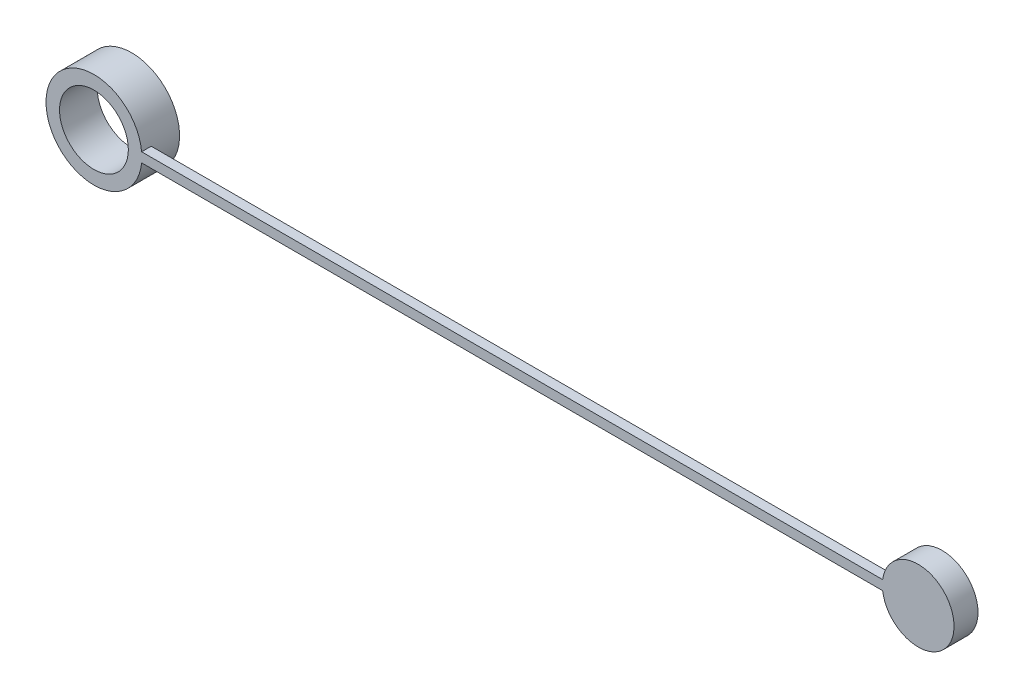
ISO-10303-21;
HEADER;
FILE_DESCRIPTION(('STEP AP214'),'2;1');
FILE_NAME('part.step','',(''),(''),'','','');
FILE_SCHEMA(('AUTOMOTIVE_DESIGN { 1 0 10303 214 1 1 1 1 }'));
ENDSEC;
DATA;
#1=APPLICATION_CONTEXT('core data for automotive mechanical design processes');
#2=APPLICATION_PROTOCOL_DEFINITION('international standard','automotive_design',2000,#1);
#3=PRODUCT_CONTEXT('',#1,'mechanical');
#4=PRODUCT('Part','Part','',(#3));
#5=PRODUCT_RELATED_PRODUCT_CATEGORY('part','',(#4));
#6=PRODUCT_DEFINITION_FORMATION('','',#4);
#7=PRODUCT_DEFINITION_CONTEXT('part definition',#1,'design');
#8=PRODUCT_DEFINITION('design','',#6,#7);
#9=PRODUCT_DEFINITION_SHAPE('','',#8);
#10=(LENGTH_UNIT() NAMED_UNIT(*) SI_UNIT(.MILLI.,.METRE.));
#11=(NAMED_UNIT(*) PLANE_ANGLE_UNIT() SI_UNIT($,.RADIAN.));
#12=(NAMED_UNIT(*) SI_UNIT($,.STERADIAN.) SOLID_ANGLE_UNIT());
#13=UNCERTAINTY_MEASURE_WITH_UNIT(LENGTH_MEASURE(1.E-05),#10,'distance_accuracy_value','');
#14=(GEOMETRIC_REPRESENTATION_CONTEXT(3) GLOBAL_UNCERTAINTY_ASSIGNED_CONTEXT((#13)) GLOBAL_UNIT_ASSIGNED_CONTEXT((#10,
#11,#12)) REPRESENTATION_CONTEXT('',''));
#15=CARTESIAN_POINT('',(0.,0.,0.));
#16=DIRECTION('',(0.,0.,1.));
#17=DIRECTION('',(1.,0.,0.));
#18=AXIS2_PLACEMENT_3D('',#15,#16,#17);
#19=CARTESIAN_POINT('',(0.,0.,-0.5));
#20=DIRECTION('',(0.,0.,-1.));
#21=DIRECTION('',(-1.,0.,0.));
#22=AXIS2_PLACEMENT_3D('',#19,#20,#21);
#23=PLANE('',#22);
#24=DIRECTION('',(1.,0.,0.));
#25=VECTOR('',#24,1.);
#26=CARTESIAN_POINT('',(28.7351824097437,-0.499999999999995,-0.5));
#27=LINE('',#26,#25);
#28=CARTESIAN_POINT('',(33.7101195952769,-0.499999999999998,-0.5));
#29=VERTEX_POINT('',#28);
#30=CARTESIAN_POINT('',(111.001495465017,-0.499999999999995,-0.5));
#31=VERTEX_POINT('',#30);
#32=EDGE_CURVE('E85',#29,#31,#27,.T.);
#33=ORIENTED_EDGE('',*,*,#32,.F.);
#34=CARTESIAN_POINT('',(28.7351824097438,0.,-0.5));
#35=DIRECTION('',(0.,0.,-1.));
#36=DIRECTION('',(-1.,0.,0.));
#37=AXIS2_PLACEMENT_3D('',#34,#35,#36);
#38=CIRCLE('',#37,5.);
#39=CARTESIAN_POINT('',(33.7101195952769,0.500000000000009,-0.5));
#40=VERTEX_POINT('',#39);
#41=EDGE_CURVE('E81',#40,#29,#38,.T.);
#42=ORIENTED_EDGE('',*,*,#41,.F.);
#43=DIRECTION('',(1.,0.,0.));
#44=VECTOR('',#43,1.);
#45=CARTESIAN_POINT('',(28.7351824097437,0.500000000000005,-0.5));
#46=LINE('',#45,#44);
#47=CARTESIAN_POINT('',(111.001495465017,0.500000000000005,-0.5));
#48=VERTEX_POINT('',#47);
#49=EDGE_CURVE('E83',#40,#48,#46,.T.);
#50=ORIENTED_EDGE('',*,*,#49,.T.);
#51=CARTESIAN_POINT('',(114.707907688302,0.,-0.5));
#52=DIRECTION('',(0.,0.,-1.));
#53=DIRECTION('',(-1.,0.,0.));
#54=AXIS2_PLACEMENT_3D('',#51,#52,#53);
#55=CIRCLE('',#54,3.73998550383732);
#56=EDGE_CURVE('E12',#48,#31,#55,.F.);
#57=ORIENTED_EDGE('',*,*,#56,.T.);
#58=EDGE_LOOP('',(#33,#42,#50,#57));
#59=FACE_BOUND('',#58,.T.);
#60=ADVANCED_FACE('F39',(#59),#23,.T.);
#61=CARTESIAN_POINT('',(28.7351824097437,-0.499999999999995,0.5));
#62=DIRECTION('',(0.,1.,0.));
#63=DIRECTION('',(0.,0.,1.));
#64=AXIS2_PLACEMENT_3D('',#61,#62,#63);
#65=PLANE('',#64);
#66=DIRECTION('',(0.,0.,-1.));
#67=VECTOR('',#66,1.);
#68=CARTESIAN_POINT('',(111.001495465017,-0.499999999999995,0.5));
#69=LINE('',#68,#67);
#70=CARTESIAN_POINT('',(111.001495465017,-0.499999999999994,0.5));
#71=VERTEX_POINT('',#70);
#72=EDGE_CURVE('E55',#71,#31,#69,.T.);
#73=ORIENTED_EDGE('',*,*,#72,.F.);
#74=DIRECTION('',(1.,0.,0.));
#75=VECTOR('',#74,1.);
#76=CARTESIAN_POINT('',(28.7351824097437,-0.499999999999995,0.5));
#77=LINE('',#76,#75);
#78=CARTESIAN_POINT('',(33.7101195952768,-0.499999999999995,0.5));
#79=VERTEX_POINT('',#78);
#80=EDGE_CURVE('E61',#79,#71,#77,.T.);
#81=ORIENTED_EDGE('',*,*,#80,.F.);
#82=DIRECTION('',(0.,0.,1.));
#83=VECTOR('',#82,1.);
#84=CARTESIAN_POINT('',(33.7101195952768,-0.499999999999995,-9.5));
#85=LINE('',#84,#83);
#86=EDGE_CURVE('E104',#79,#29,#85,.F.);
#87=ORIENTED_EDGE('',*,*,#86,.T.);
#88=ORIENTED_EDGE('',*,*,#32,.T.);
#89=EDGE_LOOP('',(#73,#81,#87,#88));
#90=FACE_BOUND('',#89,.T.);
#91=ADVANCED_FACE('F112',(#90),#65,.F.);
#92=CARTESIAN_POINT('',(28.7351824097437,0.500000000000005,0.5));
#93=DIRECTION('',(0.,1.,0.));
#94=DIRECTION('',(0.,0.,1.));
#95=AXIS2_PLACEMENT_3D('',#92,#93,#94);
#96=PLANE('',#95);
#97=DIRECTION('',(1.,0.,0.));
#98=VECTOR('',#97,1.);
#99=CARTESIAN_POINT('',(28.7351824097437,0.500000000000005,0.5));
#100=LINE('',#99,#98);
#101=CARTESIAN_POINT('',(33.7101195952768,0.500000000000006,0.5));
#102=VERTEX_POINT('',#101);
#103=CARTESIAN_POINT('',(111.001495465017,0.500000000000004,0.5));
#104=VERTEX_POINT('',#103);
#105=EDGE_CURVE('E48',#102,#104,#100,.T.);
#106=ORIENTED_EDGE('',*,*,#105,.T.);
#107=DIRECTION('',(0.,0.,-1.));
#108=VECTOR('',#107,1.);
#109=CARTESIAN_POINT('',(111.001495465017,0.500000000000005,0.5));
#110=LINE('',#109,#108);
#111=EDGE_CURVE('E97',#104,#48,#110,.T.);
#112=ORIENTED_EDGE('',*,*,#111,.T.);
#113=ORIENTED_EDGE('',*,*,#49,.F.);
#114=DIRECTION('',(0.,0.,1.));
#115=VECTOR('',#114,1.);
#116=CARTESIAN_POINT('',(33.7101195952768,0.500000000000005,-9.5));
#117=LINE('',#116,#115);
#118=EDGE_CURVE('E95',#102,#40,#117,.F.);
#119=ORIENTED_EDGE('',*,*,#118,.F.);
#120=EDGE_LOOP('',(#106,#112,#113,#119));
#121=FACE_BOUND('',#120,.T.);
#122=ADVANCED_FACE('F94',(#121),#96,.T.);
#123=CARTESIAN_POINT('',(0.,0.,0.5));
#124=DIRECTION('',(0.,0.,-1.));
#125=DIRECTION('',(-1.,0.,0.));
#126=AXIS2_PLACEMENT_3D('',#123,#124,#125);
#127=PLANE('',#126);
#128=CARTESIAN_POINT('',(28.7351824097438,0.,0.5));
#129=DIRECTION('',(0.,0.,1.));
#130=DIRECTION('',(1.,0.,0.));
#131=AXIS2_PLACEMENT_3D('',#128,#129,#130);
#132=CIRCLE('',#131,3.58904681452832);
#133=CARTESIAN_POINT('',(32.3242292242721,0.,0.5));
#134=VERTEX_POINT('',#133);
#135=EDGE_CURVE('E116',#134,#134,#132,.T.);
#136=ORIENTED_EDGE('',*,*,#135,.F.);
#137=EDGE_LOOP('',(#136));
#138=FACE_BOUND('',#137,.T.);
#139=ORIENTED_EDGE('',*,*,#80,.T.);
#140=CARTESIAN_POINT('',(114.707907688302,0.,0.5));
#141=DIRECTION('',(0.,0.,1.));
#142=DIRECTION('',(1.,0.,0.));
#143=AXIS2_PLACEMENT_3D('',#140,#141,#142);
#144=CIRCLE('',#143,3.73998550383732);
#145=EDGE_CURVE('E119',#71,#104,#144,.T.);
#146=ORIENTED_EDGE('',*,*,#145,.T.);
#147=ORIENTED_EDGE('',*,*,#105,.F.);
#148=CARTESIAN_POINT('',(28.7351824097438,0.,0.5));
#149=DIRECTION('',(0.,0.,1.));
#150=DIRECTION('',(1.,0.,0.));
#151=AXIS2_PLACEMENT_3D('',#148,#149,#150);
#152=CIRCLE('',#151,5.);
#153=EDGE_CURVE('E103',#102,#79,#152,.T.);
#154=ORIENTED_EDGE('',*,*,#153,.T.);
#155=EDGE_LOOP('',(#139,#146,#147,#154));
#156=FACE_BOUND('',#155,.T.);
#157=ADVANCED_FACE('F114',(#138,#156),#127,.F.);
#158=CARTESIAN_POINT('',(114.707907688302,0.,0.5));
#159=DIRECTION('',(0.,0.,-1.));
#160=DIRECTION('',(-1.,0.,0.));
#161=AXIS2_PLACEMENT_3D('',#158,#159,#160);
#162=CYLINDRICAL_SURFACE('',#161,3.73998550383732);
#163=CARTESIAN_POINT('',(114.707907688302,0.,-2.));
#164=DIRECTION('',(0.,0.,1.));
#165=DIRECTION('',(1.,0.,0.));
#166=AXIS2_PLACEMENT_3D('',#163,#164,#165);
#167=CIRCLE('',#166,3.73998550383732);
#168=CARTESIAN_POINT('',(118.447893192139,0.,-2.));
#169=VERTEX_POINT('',#168);
#170=EDGE_CURVE('E43',#169,#169,#167,.T.);
#171=ORIENTED_EDGE('',*,*,#170,.T.);
#172=EDGE_LOOP('',(#171));
#173=FACE_BOUND('',#172,.T.);
#174=ORIENTED_EDGE('',*,*,#145,.F.);
#175=ORIENTED_EDGE('',*,*,#72,.T.);
#176=ORIENTED_EDGE('',*,*,#56,.F.);
#177=ORIENTED_EDGE('',*,*,#111,.F.);
#178=EDGE_LOOP('',(#174,#175,#176,#177));
#179=FACE_BOUND('',#178,.T.);
#180=ADVANCED_FACE('F123',(#173,#179),#162,.T.);
#181=CARTESIAN_POINT('',(114.707907688302,0.,-2.));
#182=DIRECTION('',(0.,0.,1.));
#183=DIRECTION('',(1.,0.,0.));
#184=AXIS2_PLACEMENT_3D('',#181,#182,#183);
#185=PLANE('',#184);
#186=ORIENTED_EDGE('',*,*,#170,.F.);
#187=EDGE_LOOP('',(#186));
#188=FACE_BOUND('',#187,.T.);
#189=ADVANCED_FACE('F41',(#188),#185,.F.);
#190=CARTESIAN_POINT('',(28.7351824097438,0.,0.5));
#191=DIRECTION('',(0.,0.,-1.));
#192=DIRECTION('',(-1.,0.,0.));
#193=AXIS2_PLACEMENT_3D('',#190,#191,#192);
#194=CYLINDRICAL_SURFACE('',#193,5.);
#195=ORIENTED_EDGE('',*,*,#118,.T.);
#196=ORIENTED_EDGE('',*,*,#41,.T.);
#197=ORIENTED_EDGE('',*,*,#86,.F.);
#198=ORIENTED_EDGE('',*,*,#153,.F.);
#199=EDGE_LOOP('',(#195,#196,#197,#198));
#200=FACE_BOUND('',#199,.T.);
#201=CARTESIAN_POINT('',(28.7351824097438,0.,-3.43));
#202=DIRECTION('',(0.,0.,-1.));
#203=DIRECTION('',(-1.,0.,0.));
#204=AXIS2_PLACEMENT_3D('',#201,#202,#203);
#205=CIRCLE('',#204,5.);
#206=CARTESIAN_POINT('',(23.7351824097438,0.,-3.43));
#207=VERTEX_POINT('',#206);
#208=EDGE_CURVE('E88',#207,#207,#205,.T.);
#209=ORIENTED_EDGE('',*,*,#208,.F.);
#210=EDGE_LOOP('',(#209));
#211=FACE_BOUND('',#210,.T.);
#212=ADVANCED_FACE('F100',(#200,#211),#194,.T.);
#213=CARTESIAN_POINT('',(28.7351824097438,0.,-0.5));
#214=DIRECTION('',(0.,0.,1.));
#215=DIRECTION('',(1.,0.,0.));
#216=AXIS2_PLACEMENT_3D('',#213,#214,#215);
#217=CYLINDRICAL_SURFACE('',#216,3.58904681452832);
#218=ORIENTED_EDGE('',*,*,#135,.T.);
#219=EDGE_LOOP('',(#218));
#220=FACE_BOUND('',#219,.T.);
#221=CARTESIAN_POINT('',(28.7351824097438,0.,-3.43));
#222=DIRECTION('',(0.,0.,-1.));
#223=DIRECTION('',(-1.,0.,0.));
#224=AXIS2_PLACEMENT_3D('',#221,#222,#223);
#225=CIRCLE('',#224,3.58904681452832);
#226=CARTESIAN_POINT('',(25.1461355952154,0.,-3.43));
#227=VERTEX_POINT('',#226);
#228=EDGE_CURVE('E89',#227,#227,#225,.T.);
#229=ORIENTED_EDGE('',*,*,#228,.T.);
#230=EDGE_LOOP('',(#229));
#231=FACE_BOUND('',#230,.T.);
#232=ADVANCED_FACE('F189',(#220,#231),#217,.F.);
#233=CARTESIAN_POINT('',(28.7351824097438,0.,-3.43));
#234=DIRECTION('',(0.,0.,-1.));
#235=DIRECTION('',(-1.,0.,0.));
#236=AXIS2_PLACEMENT_3D('',#233,#234,#235);
#237=PLANE('',#236);
#238=ORIENTED_EDGE('',*,*,#208,.T.);
#239=EDGE_LOOP('',(#238));
#240=FACE_BOUND('',#239,.T.);
#241=ORIENTED_EDGE('',*,*,#228,.F.);
#242=EDGE_LOOP('',(#241));
#243=FACE_BOUND('',#242,.T.);
#244=ADVANCED_FACE('F196',(#240,#243),#237,.T.);
#245=CLOSED_SHELL('',(#60,#91,#122,#157,#180,#189,#212,#232,#244));
#246=MANIFOLD_SOLID_BREP('B2',#245);
#247=ADVANCED_BREP_SHAPE_REPRESENTATION('',(#18,#246),#14);
#248=SHAPE_DEFINITION_REPRESENTATION(#9,#247);
ENDSEC;
END-ISO-10303-21;
